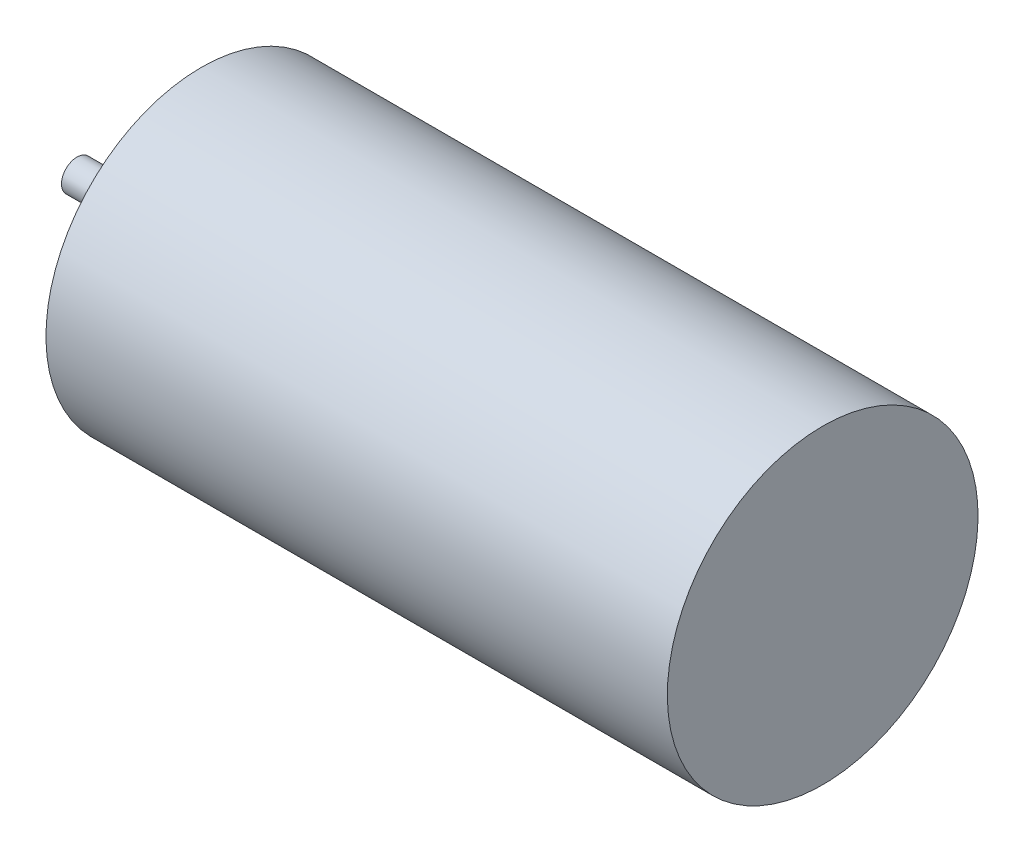
ISO-10303-21;
HEADER;
FILE_DESCRIPTION(('STEP AP214'),'2;1');
FILE_NAME('part.step','',(''),(''),'','','');
FILE_SCHEMA(('AUTOMOTIVE_DESIGN { 1 0 10303 214 1 1 1 1 }'));
ENDSEC;
DATA;
#1=APPLICATION_CONTEXT('core data for automotive mechanical design processes');
#2=APPLICATION_PROTOCOL_DEFINITION('international standard','automotive_design',2000,#1);
#3=PRODUCT_CONTEXT('',#1,'mechanical');
#4=PRODUCT('Part','Part','',(#3));
#5=PRODUCT_RELATED_PRODUCT_CATEGORY('part','',(#4));
#6=PRODUCT_DEFINITION_FORMATION('','',#4);
#7=PRODUCT_DEFINITION_CONTEXT('part definition',#1,'design');
#8=PRODUCT_DEFINITION('design','',#6,#7);
#9=PRODUCT_DEFINITION_SHAPE('','',#8);
#10=(LENGTH_UNIT() NAMED_UNIT(*) SI_UNIT(.MILLI.,.METRE.));
#11=(NAMED_UNIT(*) PLANE_ANGLE_UNIT() SI_UNIT($,.RADIAN.));
#12=(NAMED_UNIT(*) SI_UNIT($,.STERADIAN.) SOLID_ANGLE_UNIT());
#13=UNCERTAINTY_MEASURE_WITH_UNIT(LENGTH_MEASURE(1.E-05),#10,'distance_accuracy_value','');
#14=(GEOMETRIC_REPRESENTATION_CONTEXT(3) GLOBAL_UNCERTAINTY_ASSIGNED_CONTEXT((#13)) GLOBAL_UNIT_ASSIGNED_CONTEXT((#10,
#11,#12)) REPRESENTATION_CONTEXT('',''));
#15=CARTESIAN_POINT('',(0.,0.,0.));
#16=DIRECTION('',(0.,0.,1.));
#17=DIRECTION('',(1.,0.,0.));
#18=AXIS2_PLACEMENT_3D('',#15,#16,#17);
#19=CARTESIAN_POINT('',(-8.,0.999999999999999,0.));
#20=DIRECTION('',(-1.,0.,0.));
#21=DIRECTION('',(0.,-1.,0.));
#22=AXIS2_PLACEMENT_3D('',#19,#20,#21);
#23=PLANE('',#22);
#24=CARTESIAN_POINT('',(-8.,0.,0.));
#25=DIRECTION('',(1.,0.,0.));
#26=DIRECTION('',(0.,1.,0.));
#27=AXIS2_PLACEMENT_3D('',#24,#25,#26);
#28=CIRCLE('',#27,0.999999999999999);
#29=CARTESIAN_POINT('',(-8.,0.999999999999999,0.));
#30=VERTEX_POINT('',#29);
#31=EDGE_CURVE('E48',#30,#30,#28,.T.);
#32=ORIENTED_EDGE('',*,*,#31,.F.);
#33=EDGE_LOOP('',(#32));
#34=FACE_BOUND('',#33,.T.);
#35=ADVANCED_FACE('F34',(#34),#23,.T.);
#36=CARTESIAN_POINT('',(40.,10.,0.));
#37=DIRECTION('',(1.,0.,0.));
#38=DIRECTION('',(0.,1.,0.));
#39=AXIS2_PLACEMENT_3D('',#36,#37,#38);
#40=PLANE('',#39);
#41=CARTESIAN_POINT('',(40.,0.,0.));
#42=DIRECTION('',(1.,0.,0.));
#43=DIRECTION('',(0.,1.,0.));
#44=AXIS2_PLACEMENT_3D('',#41,#42,#43);
#45=CIRCLE('',#44,10.);
#46=CARTESIAN_POINT('',(40.,10.,0.));
#47=VERTEX_POINT('',#46);
#48=EDGE_CURVE('E10',#47,#47,#45,.T.);
#49=ORIENTED_EDGE('',*,*,#48,.T.);
#50=EDGE_LOOP('',(#49));
#51=FACE_BOUND('',#50,.T.);
#52=ADVANCED_FACE('F58',(#51),#40,.T.);
#53=CARTESIAN_POINT('',(40.,0.,0.));
#54=DIRECTION('',(1.,0.,0.));
#55=DIRECTION('',(0.,1.,0.));
#56=AXIS2_PLACEMENT_3D('',#53,#54,#55);
#57=CYLINDRICAL_SURFACE('',#56,10.);
#58=CARTESIAN_POINT('',(0.,0.,0.));
#59=DIRECTION('',(1.,0.,0.));
#60=DIRECTION('',(0.,1.,0.));
#61=AXIS2_PLACEMENT_3D('',#58,#59,#60);
#62=CIRCLE('',#61,10.);
#63=CARTESIAN_POINT('',(0.,10.,0.));
#64=VERTEX_POINT('',#63);
#65=EDGE_CURVE('E40',#64,#64,#62,.T.);
#66=ORIENTED_EDGE('',*,*,#65,.T.);
#67=EDGE_LOOP('',(#66));
#68=FACE_BOUND('',#67,.T.);
#69=ORIENTED_EDGE('',*,*,#48,.F.);
#70=EDGE_LOOP('',(#69));
#71=FACE_BOUND('',#70,.T.);
#72=ADVANCED_FACE('F62',(#68,#71),#57,.T.);
#73=CARTESIAN_POINT('',(0.,1.,0.));
#74=DIRECTION('',(-1.,0.,0.));
#75=DIRECTION('',(0.,-1.,0.));
#76=AXIS2_PLACEMENT_3D('',#73,#74,#75);
#77=PLANE('',#76);
#78=CARTESIAN_POINT('',(0.,0.,0.));
#79=DIRECTION('',(1.,0.,0.));
#80=DIRECTION('',(0.,1.,0.));
#81=AXIS2_PLACEMENT_3D('',#78,#79,#80);
#82=CIRCLE('',#81,1.);
#83=CARTESIAN_POINT('',(0.,1.,0.));
#84=VERTEX_POINT('',#83);
#85=EDGE_CURVE('E44',#84,#84,#82,.T.);
#86=ORIENTED_EDGE('',*,*,#85,.T.);
#87=EDGE_LOOP('',(#86));
#88=FACE_BOUND('',#87,.T.);
#89=ORIENTED_EDGE('',*,*,#65,.F.);
#90=EDGE_LOOP('',(#89));
#91=FACE_BOUND('',#90,.T.);
#92=ADVANCED_FACE('F66',(#88,#91),#77,.T.);
#93=CARTESIAN_POINT('',(40.,0.,0.));
#94=DIRECTION('',(1.,0.,0.));
#95=DIRECTION('',(0.,1.,0.));
#96=AXIS2_PLACEMENT_3D('',#93,#94,#95);
#97=CYLINDRICAL_SURFACE('',#96,1.);
#98=ORIENTED_EDGE('',*,*,#31,.T.);
#99=EDGE_LOOP('',(#98));
#100=FACE_BOUND('',#99,.T.);
#101=ORIENTED_EDGE('',*,*,#85,.F.);
#102=EDGE_LOOP('',(#101));
#103=FACE_BOUND('',#102,.T.);
#104=ADVANCED_FACE('F54',(#100,#103),#97,.T.);
#105=CLOSED_SHELL('',(#35,#52,#72,#92,#104));
#106=MANIFOLD_SOLID_BREP('B2',#105);
#107=ADVANCED_BREP_SHAPE_REPRESENTATION('',(#18,#106),#14);
#108=SHAPE_DEFINITION_REPRESENTATION(#9,#107);
ENDSEC;
END-ISO-10303-21;
